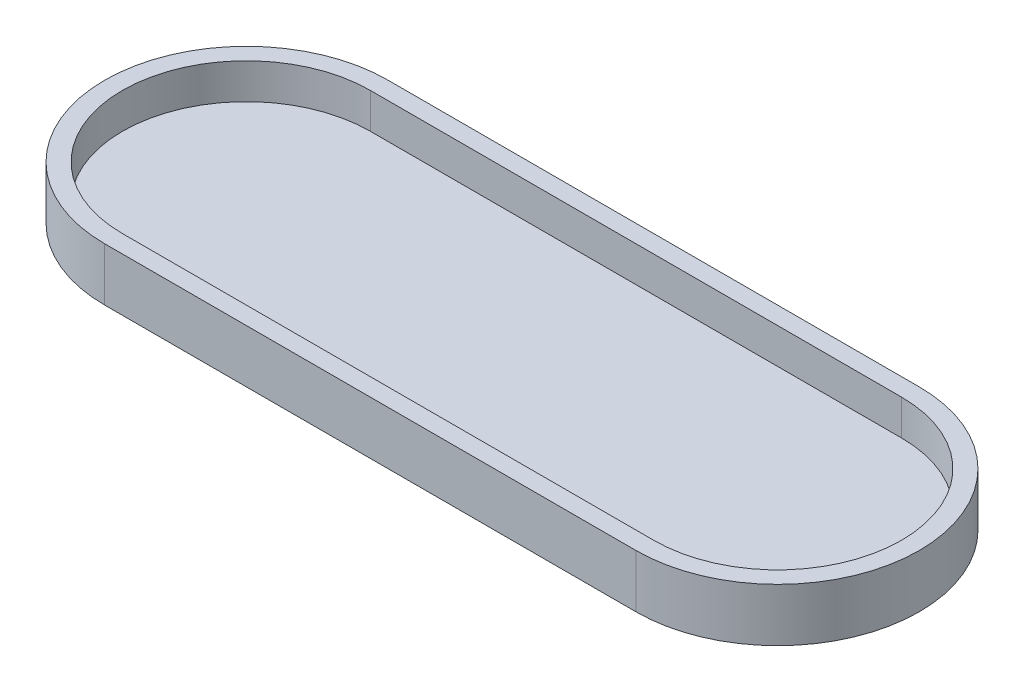
ISO-10303-21;
HEADER;
FILE_DESCRIPTION(('STEP AP214'),'2;1');
FILE_NAME('part.step','',(''),(''),'','','');
FILE_SCHEMA(('AUTOMOTIVE_DESIGN { 1 0 10303 214 1 1 1 1 }'));
ENDSEC;
DATA;
#1=APPLICATION_CONTEXT('core data for automotive mechanical design processes');
#2=APPLICATION_PROTOCOL_DEFINITION('international standard','automotive_design',2000,#1);
#3=PRODUCT_CONTEXT('',#1,'mechanical');
#4=PRODUCT('Part','Part','',(#3));
#5=PRODUCT_RELATED_PRODUCT_CATEGORY('part','',(#4));
#6=PRODUCT_DEFINITION_FORMATION('','',#4);
#7=PRODUCT_DEFINITION_CONTEXT('part definition',#1,'design');
#8=PRODUCT_DEFINITION('design','',#6,#7);
#9=PRODUCT_DEFINITION_SHAPE('','',#8);
#10=(LENGTH_UNIT() NAMED_UNIT(*) SI_UNIT(.MILLI.,.METRE.));
#11=(NAMED_UNIT(*) PLANE_ANGLE_UNIT() SI_UNIT($,.RADIAN.));
#12=(NAMED_UNIT(*) SI_UNIT($,.STERADIAN.) SOLID_ANGLE_UNIT());
#13=UNCERTAINTY_MEASURE_WITH_UNIT(LENGTH_MEASURE(1.E-05),#10,'distance_accuracy_value','');
#14=(GEOMETRIC_REPRESENTATION_CONTEXT(3) GLOBAL_UNCERTAINTY_ASSIGNED_CONTEXT((#13)) GLOBAL_UNIT_ASSIGNED_CONTEXT((#10,
#11,#12)) REPRESENTATION_CONTEXT('',''));
#15=CARTESIAN_POINT('',(0.,0.,0.));
#16=DIRECTION('',(0.,0.,1.));
#17=DIRECTION('',(1.,0.,0.));
#18=AXIS2_PLACEMENT_3D('',#15,#16,#17);
#19=CARTESIAN_POINT('',(0.,30.,0.));
#20=DIRECTION('',(0.,-1.,0.));
#21=DIRECTION('',(0.,0.,-1.));
#22=AXIS2_PLACEMENT_3D('',#19,#20,#21);
#23=CYLINDRICAL_SURFACE('',#22,80.);
#24=CARTESIAN_POINT('',(0.,0.,0.));
#25=DIRECTION('',(0.,1.,0.));
#26=DIRECTION('',(0.,0.,1.));
#27=AXIS2_PLACEMENT_3D('',#24,#25,#26);
#28=CIRCLE('',#27,80.);
#29=CARTESIAN_POINT('',(0.,0.,-80.));
#30=VERTEX_POINT('',#29);
#31=CARTESIAN_POINT('',(0.,0.,80.));
#32=VERTEX_POINT('',#31);
#33=EDGE_CURVE('E162',#30,#32,#28,.T.);
#34=ORIENTED_EDGE('',*,*,#33,.T.);
#35=DIRECTION('',(0.,-1.,0.));
#36=VECTOR('',#35,1.);
#37=CARTESIAN_POINT('',(0.,30.,80.));
#38=LINE('',#37,#36);
#39=CARTESIAN_POINT('',(0.,30.,80.));
#40=VERTEX_POINT('',#39);
#41=EDGE_CURVE('E11',#40,#32,#38,.T.);
#42=ORIENTED_EDGE('',*,*,#41,.F.);
#43=CARTESIAN_POINT('',(0.,30.,0.));
#44=DIRECTION('',(0.,1.,0.));
#45=DIRECTION('',(0.,0.,1.));
#46=AXIS2_PLACEMENT_3D('',#43,#44,#45);
#47=CIRCLE('',#46,80.);
#48=CARTESIAN_POINT('',(0.,30.,-80.));
#49=VERTEX_POINT('',#48);
#50=EDGE_CURVE('E168',#49,#40,#47,.T.);
#51=ORIENTED_EDGE('',*,*,#50,.F.);
#52=DIRECTION('',(0.,-1.,0.));
#53=VECTOR('',#52,1.);
#54=CARTESIAN_POINT('',(0.,30.,-80.));
#55=LINE('',#54,#53);
#56=EDGE_CURVE('E178',#49,#30,#55,.T.);
#57=ORIENTED_EDGE('',*,*,#56,.T.);
#58=EDGE_LOOP('',(#34,#42,#51,#57));
#59=FACE_BOUND('',#58,.T.);
#60=ADVANCED_FACE('F43',(#59),#23,.T.);
#61=CARTESIAN_POINT('',(0.,30.,80.));
#62=DIRECTION('',(0.,0.,-1.));
#63=DIRECTION('',(-1.,0.,0.));
#64=AXIS2_PLACEMENT_3D('',#61,#62,#63);
#65=PLANE('',#64);
#66=DIRECTION('',(1.,0.,0.));
#67=VECTOR('',#66,1.);
#68=CARTESIAN_POINT('',(0.,0.,80.));
#69=LINE('',#68,#67);
#70=CARTESIAN_POINT('',(300.,0.,80.));
#71=VERTEX_POINT('',#70);
#72=EDGE_CURVE('E182',#32,#71,#69,.T.);
#73=ORIENTED_EDGE('',*,*,#72,.T.);
#74=DIRECTION('',(0.,-1.,0.));
#75=VECTOR('',#74,1.);
#76=CARTESIAN_POINT('',(300.,30.,80.));
#77=LINE('',#76,#75);
#78=CARTESIAN_POINT('',(300.,30.,80.));
#79=VERTEX_POINT('',#78);
#80=EDGE_CURVE('E51',#79,#71,#77,.T.);
#81=ORIENTED_EDGE('',*,*,#80,.F.);
#82=DIRECTION('',(1.,0.,0.));
#83=VECTOR('',#82,1.);
#84=CARTESIAN_POINT('',(0.,30.,80.));
#85=LINE('',#84,#83);
#86=EDGE_CURVE('E95',#40,#79,#85,.T.);
#87=ORIENTED_EDGE('',*,*,#86,.F.);
#88=ORIENTED_EDGE('',*,*,#41,.T.);
#89=EDGE_LOOP('',(#73,#81,#87,#88));
#90=FACE_BOUND('',#89,.T.);
#91=ADVANCED_FACE('F217',(#90),#65,.F.);
#92=CARTESIAN_POINT('',(300.,30.,0.));
#93=DIRECTION('',(0.,-1.,0.));
#94=DIRECTION('',(0.,0.,-1.));
#95=AXIS2_PLACEMENT_3D('',#92,#93,#94);
#96=CYLINDRICAL_SURFACE('',#95,80.);
#97=CARTESIAN_POINT('',(300.,0.,0.));
#98=DIRECTION('',(0.,1.,0.));
#99=DIRECTION('',(0.,0.,1.));
#100=AXIS2_PLACEMENT_3D('',#97,#98,#99);
#101=CIRCLE('',#100,80.);
#102=CARTESIAN_POINT('',(300.,0.,-80.));
#103=VERTEX_POINT('',#102);
#104=EDGE_CURVE('E185',#71,#103,#101,.T.);
#105=ORIENTED_EDGE('',*,*,#104,.T.);
#106=DIRECTION('',(0.,-1.,0.));
#107=VECTOR('',#106,1.);
#108=CARTESIAN_POINT('',(300.,30.,-80.));
#109=LINE('',#108,#107);
#110=CARTESIAN_POINT('',(300.,30.,-80.));
#111=VERTEX_POINT('',#110);
#112=EDGE_CURVE('E192',#111,#103,#109,.T.);
#113=ORIENTED_EDGE('',*,*,#112,.F.);
#114=CARTESIAN_POINT('',(300.,30.,0.));
#115=DIRECTION('',(0.,1.,0.));
#116=DIRECTION('',(0.,0.,1.));
#117=AXIS2_PLACEMENT_3D('',#114,#115,#116);
#118=CIRCLE('',#117,80.);
#119=EDGE_CURVE('E173',#79,#111,#118,.T.);
#120=ORIENTED_EDGE('',*,*,#119,.F.);
#121=ORIENTED_EDGE('',*,*,#80,.T.);
#122=EDGE_LOOP('',(#105,#113,#120,#121));
#123=FACE_BOUND('',#122,.T.);
#124=ADVANCED_FACE('F199',(#123),#96,.T.);
#125=CARTESIAN_POINT('',(0.,30.,-80.));
#126=DIRECTION('',(0.,0.,1.));
#127=DIRECTION('',(1.,0.,0.));
#128=AXIS2_PLACEMENT_3D('',#125,#126,#127);
#129=PLANE('',#128);
#130=DIRECTION('',(-1.,0.,0.));
#131=VECTOR('',#130,1.);
#132=CARTESIAN_POINT('',(0.,0.,-80.));
#133=LINE('',#132,#131);
#134=EDGE_CURVE('E88',#103,#30,#133,.T.);
#135=ORIENTED_EDGE('',*,*,#134,.T.);
#136=ORIENTED_EDGE('',*,*,#56,.F.);
#137=DIRECTION('',(-1.,0.,0.));
#138=VECTOR('',#137,1.);
#139=CARTESIAN_POINT('',(0.,30.,-80.));
#140=LINE('',#139,#138);
#141=EDGE_CURVE('E67',#111,#49,#140,.T.);
#142=ORIENTED_EDGE('',*,*,#141,.F.);
#143=ORIENTED_EDGE('',*,*,#112,.T.);
#144=EDGE_LOOP('',(#135,#136,#142,#143));
#145=FACE_BOUND('',#144,.T.);
#146=ADVANCED_FACE('F207',(#145),#129,.F.);
#147=CARTESIAN_POINT('',(0.,30.,0.));
#148=DIRECTION('',(0.,1.,0.));
#149=DIRECTION('',(0.,0.,1.));
#150=AXIS2_PLACEMENT_3D('',#147,#148,#149);
#151=PLANE('',#150);
#152=CARTESIAN_POINT('',(300.,30.,0.));
#153=DIRECTION('',(0.,1.,0.));
#154=DIRECTION('',(0.,0.,1.));
#155=AXIS2_PLACEMENT_3D('',#152,#153,#154);
#156=CIRCLE('',#155,70.);
#157=CARTESIAN_POINT('',(300.,30.,70.));
#158=VERTEX_POINT('',#157);
#159=CARTESIAN_POINT('',(300.,30.,-70.));
#160=VERTEX_POINT('',#159);
#161=EDGE_CURVE('E58',#158,#160,#156,.T.);
#162=ORIENTED_EDGE('',*,*,#161,.F.);
#163=DIRECTION('',(1.,0.,0.));
#164=VECTOR('',#163,1.);
#165=CARTESIAN_POINT('',(-2.79318507107451E-13,30.,70.));
#166=LINE('',#165,#164);
#167=CARTESIAN_POINT('',(0.,30.,70.));
#168=VERTEX_POINT('',#167);
#169=EDGE_CURVE('E140',#168,#158,#166,.T.);
#170=ORIENTED_EDGE('',*,*,#169,.F.);
#171=CARTESIAN_POINT('',(0.,30.,0.));
#172=DIRECTION('',(0.,1.,0.));
#173=DIRECTION('',(0.,0.,1.));
#174=AXIS2_PLACEMENT_3D('',#171,#172,#173);
#175=CIRCLE('',#174,70.);
#176=CARTESIAN_POINT('',(-2.79318507107451E-13,30.,-70.));
#177=VERTEX_POINT('',#176);
#178=EDGE_CURVE('E144',#177,#168,#175,.T.);
#179=ORIENTED_EDGE('',*,*,#178,.F.);
#180=DIRECTION('',(-1.,0.,0.));
#181=VECTOR('',#180,1.);
#182=CARTESIAN_POINT('',(-2.79318507107451E-13,30.,-70.));
#183=LINE('',#182,#181);
#184=EDGE_CURVE('E153',#160,#177,#183,.T.);
#185=ORIENTED_EDGE('',*,*,#184,.F.);
#186=EDGE_LOOP('',(#162,#170,#179,#185));
#187=FACE_BOUND('',#186,.T.);
#188=ORIENTED_EDGE('',*,*,#50,.T.);
#189=ORIENTED_EDGE('',*,*,#86,.T.);
#190=ORIENTED_EDGE('',*,*,#119,.T.);
#191=ORIENTED_EDGE('',*,*,#141,.T.);
#192=EDGE_LOOP('',(#188,#189,#190,#191));
#193=FACE_BOUND('',#192,.T.);
#194=ADVANCED_FACE('F209',(#187,#193),#151,.T.);
#195=CARTESIAN_POINT('',(0.,0.,0.));
#196=DIRECTION('',(0.,1.,0.));
#197=DIRECTION('',(0.,0.,1.));
#198=AXIS2_PLACEMENT_3D('',#195,#196,#197);
#199=PLANE('',#198);
#200=ORIENTED_EDGE('',*,*,#33,.F.);
#201=ORIENTED_EDGE('',*,*,#134,.F.);
#202=ORIENTED_EDGE('',*,*,#104,.F.);
#203=ORIENTED_EDGE('',*,*,#72,.F.);
#204=EDGE_LOOP('',(#200,#201,#202,#203));
#205=FACE_BOUND('',#204,.T.);
#206=ADVANCED_FACE('F203',(#205),#199,.F.);
#207=CARTESIAN_POINT('',(300.,10.,0.));
#208=DIRECTION('',(0.,1.,0.));
#209=DIRECTION('',(0.,0.,1.));
#210=AXIS2_PLACEMENT_3D('',#207,#208,#209);
#211=CYLINDRICAL_SURFACE('',#210,70.);
#212=ORIENTED_EDGE('',*,*,#161,.T.);
#213=DIRECTION('',(0.,1.,0.));
#214=VECTOR('',#213,1.);
#215=CARTESIAN_POINT('',(300.,10.,-70.));
#216=LINE('',#215,#214);
#217=CARTESIAN_POINT('',(300.,10.,-70.));
#218=VERTEX_POINT('',#217);
#219=EDGE_CURVE('E115',#218,#160,#216,.T.);
#220=ORIENTED_EDGE('',*,*,#219,.F.);
#221=CARTESIAN_POINT('',(300.,10.,0.));
#222=DIRECTION('',(0.,1.,0.));
#223=DIRECTION('',(0.,0.,1.));
#224=AXIS2_PLACEMENT_3D('',#221,#222,#223);
#225=CIRCLE('',#224,70.);
#226=CARTESIAN_POINT('',(300.,10.,70.));
#227=VERTEX_POINT('',#226);
#228=EDGE_CURVE('E119',#227,#218,#225,.T.);
#229=ORIENTED_EDGE('',*,*,#228,.F.);
#230=DIRECTION('',(0.,1.,0.));
#231=VECTOR('',#230,1.);
#232=CARTESIAN_POINT('',(300.,10.,70.));
#233=LINE('',#232,#231);
#234=EDGE_CURVE('E159',#227,#158,#233,.T.);
#235=ORIENTED_EDGE('',*,*,#234,.T.);
#236=EDGE_LOOP('',(#212,#220,#229,#235));
#237=FACE_BOUND('',#236,.T.);
#238=ADVANCED_FACE('F117',(#237),#211,.F.);
#239=CARTESIAN_POINT('',(-2.79318507107451E-13,10.,70.));
#240=DIRECTION('',(0.,0.,1.));
#241=DIRECTION('',(1.,0.,0.));
#242=AXIS2_PLACEMENT_3D('',#239,#240,#241);
#243=PLANE('',#242);
#244=ORIENTED_EDGE('',*,*,#169,.T.);
#245=ORIENTED_EDGE('',*,*,#234,.F.);
#246=DIRECTION('',(1.,0.,0.));
#247=VECTOR('',#246,1.);
#248=CARTESIAN_POINT('',(-2.79318507107451E-13,10.,70.));
#249=LINE('',#248,#247);
#250=CARTESIAN_POINT('',(0.,10.,70.));
#251=VERTEX_POINT('',#250);
#252=EDGE_CURVE('E126',#251,#227,#249,.T.);
#253=ORIENTED_EDGE('',*,*,#252,.F.);
#254=DIRECTION('',(0.,1.,0.));
#255=VECTOR('',#254,1.);
#256=CARTESIAN_POINT('',(0.,10.,70.));
#257=LINE('',#256,#255);
#258=EDGE_CURVE('E163',#251,#168,#257,.T.);
#259=ORIENTED_EDGE('',*,*,#258,.T.);
#260=EDGE_LOOP('',(#244,#245,#253,#259));
#261=FACE_BOUND('',#260,.T.);
#262=ADVANCED_FACE('F260',(#261),#243,.F.);
#263=CARTESIAN_POINT('',(0.,10.,0.));
#264=DIRECTION('',(0.,1.,0.));
#265=DIRECTION('',(0.,0.,1.));
#266=AXIS2_PLACEMENT_3D('',#263,#264,#265);
#267=CYLINDRICAL_SURFACE('',#266,70.);
#268=ORIENTED_EDGE('',*,*,#178,.T.);
#269=ORIENTED_EDGE('',*,*,#258,.F.);
#270=CARTESIAN_POINT('',(0.,10.,0.));
#271=DIRECTION('',(0.,1.,0.));
#272=DIRECTION('',(0.,0.,1.));
#273=AXIS2_PLACEMENT_3D('',#270,#271,#272);
#274=CIRCLE('',#273,70.);
#275=CARTESIAN_POINT('',(-2.79318507107451E-13,10.,-70.));
#276=VERTEX_POINT('',#275);
#277=EDGE_CURVE('E135',#276,#251,#274,.T.);
#278=ORIENTED_EDGE('',*,*,#277,.F.);
#279=DIRECTION('',(0.,1.,0.));
#280=VECTOR('',#279,1.);
#281=CARTESIAN_POINT('',(-2.79318507107451E-13,10.,-70.));
#282=LINE('',#281,#280);
#283=EDGE_CURVE('E125',#276,#177,#282,.T.);
#284=ORIENTED_EDGE('',*,*,#283,.T.);
#285=EDGE_LOOP('',(#268,#269,#278,#284));
#286=FACE_BOUND('',#285,.T.);
#287=ADVANCED_FACE('F270',(#286),#267,.F.);
#288=CARTESIAN_POINT('',(-2.79318507107451E-13,10.,-70.));
#289=DIRECTION('',(0.,0.,-1.));
#290=DIRECTION('',(-1.,0.,0.));
#291=AXIS2_PLACEMENT_3D('',#288,#289,#290);
#292=PLANE('',#291);
#293=ORIENTED_EDGE('',*,*,#184,.T.);
#294=ORIENTED_EDGE('',*,*,#283,.F.);
#295=DIRECTION('',(-1.,0.,0.));
#296=VECTOR('',#295,1.);
#297=CARTESIAN_POINT('',(-2.79318507107451E-13,10.,-70.));
#298=LINE('',#297,#296);
#299=EDGE_CURVE('E129',#218,#276,#298,.T.);
#300=ORIENTED_EDGE('',*,*,#299,.F.);
#301=ORIENTED_EDGE('',*,*,#219,.T.);
#302=EDGE_LOOP('',(#293,#294,#300,#301));
#303=FACE_BOUND('',#302,.T.);
#304=ADVANCED_FACE('F130',(#303),#292,.F.);
#305=CARTESIAN_POINT('',(300.,10.,0.));
#306=DIRECTION('',(0.,1.,0.));
#307=DIRECTION('',(0.,0.,1.));
#308=AXIS2_PLACEMENT_3D('',#305,#306,#307);
#309=PLANE('',#308);
#310=ORIENTED_EDGE('',*,*,#228,.T.);
#311=ORIENTED_EDGE('',*,*,#299,.T.);
#312=ORIENTED_EDGE('',*,*,#277,.T.);
#313=ORIENTED_EDGE('',*,*,#252,.T.);
#314=EDGE_LOOP('',(#310,#311,#312,#313));
#315=FACE_BOUND('',#314,.T.);
#316=ADVANCED_FACE('F137',(#315),#309,.T.);
#317=CLOSED_SHELL('',(#60,#91,#124,#146,#194,#206,#238,#262,#287,#304,#316));
#318=MANIFOLD_SOLID_BREP('B2',#317);
#319=ADVANCED_BREP_SHAPE_REPRESENTATION('',(#18,#318),#14);
#320=SHAPE_DEFINITION_REPRESENTATION(#9,#319);
ENDSEC;
END-ISO-10303-21;
